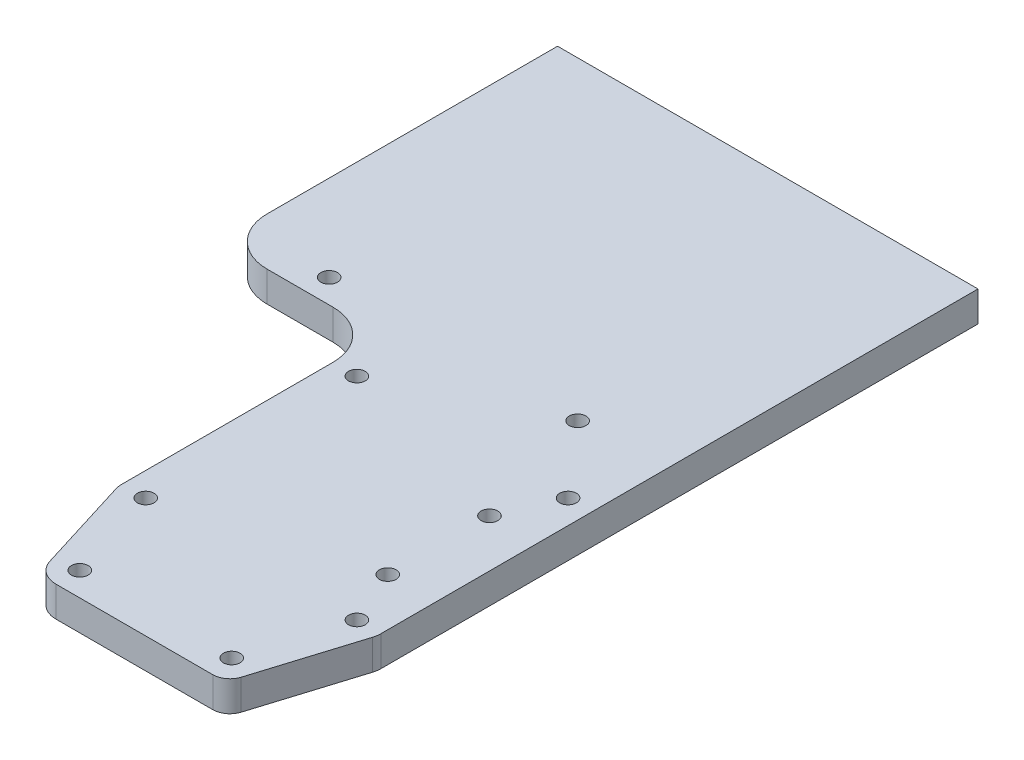
ISO-10303-21;
HEADER;
FILE_DESCRIPTION(('STEP AP214'),'2;1');
FILE_NAME('part.step','',(''),(''),'','','');
FILE_SCHEMA(('AUTOMOTIVE_DESIGN { 1 0 10303 214 1 1 1 1 }'));
ENDSEC;
DATA;
#1=APPLICATION_CONTEXT('core data for automotive mechanical design processes');
#2=APPLICATION_PROTOCOL_DEFINITION('international standard','automotive_design',2000,#1);
#3=PRODUCT_CONTEXT('',#1,'mechanical');
#4=PRODUCT('Part','Part','',(#3));
#5=PRODUCT_RELATED_PRODUCT_CATEGORY('part','',(#4));
#6=PRODUCT_DEFINITION_FORMATION('','',#4);
#7=PRODUCT_DEFINITION_CONTEXT('part definition',#1,'design');
#8=PRODUCT_DEFINITION('design','',#6,#7);
#9=PRODUCT_DEFINITION_SHAPE('','',#8);
#10=(LENGTH_UNIT() NAMED_UNIT(*) SI_UNIT(.MILLI.,.METRE.));
#11=(NAMED_UNIT(*) PLANE_ANGLE_UNIT() SI_UNIT($,.RADIAN.));
#12=(NAMED_UNIT(*) SI_UNIT($,.STERADIAN.) SOLID_ANGLE_UNIT());
#13=UNCERTAINTY_MEASURE_WITH_UNIT(LENGTH_MEASURE(1.E-05),#10,'distance_accuracy_value','');
#14=(GEOMETRIC_REPRESENTATION_CONTEXT(3) GLOBAL_UNCERTAINTY_ASSIGNED_CONTEXT((#13)) GLOBAL_UNIT_ASSIGNED_CONTEXT((#10,
#11,#12)) REPRESENTATION_CONTEXT('',''));
#15=CARTESIAN_POINT('',(0.,0.,0.));
#16=DIRECTION('',(0.,0.,1.));
#17=DIRECTION('',(1.,0.,0.));
#18=AXIS2_PLACEMENT_3D('',#15,#16,#17);
#19=CARTESIAN_POINT('',(0.,0.,-150.));
#20=DIRECTION('',(0.,0.,1.));
#21=DIRECTION('',(1.,0.,0.));
#22=AXIS2_PLACEMENT_3D('',#19,#20,#21);
#23=PLANE('',#22);
#24=DIRECTION('',(1.,0.,0.));
#25=VECTOR('',#24,1.);
#26=CARTESIAN_POINT('',(0.,6.35,-150.));
#27=LINE('',#26,#25);
#28=CARTESIAN_POINT('',(0.,6.35,-150.));
#29=VERTEX_POINT('',#28);
#30=CARTESIAN_POINT('',(88.,6.35,-150.));
#31=VERTEX_POINT('',#30);
#32=EDGE_CURVE('E11',#29,#31,#27,.T.);
#33=ORIENTED_EDGE('',*,*,#32,.T.);
#34=DIRECTION('',(0.,1.,0.));
#35=VECTOR('',#34,1.);
#36=CARTESIAN_POINT('',(88.,6.35,-150.));
#37=LINE('',#36,#35);
#38=CARTESIAN_POINT('',(88.,0.,-150.));
#39=VERTEX_POINT('',#38);
#40=EDGE_CURVE('E57',#39,#31,#37,.T.);
#41=ORIENTED_EDGE('',*,*,#40,.F.);
#42=DIRECTION('',(1.,0.,0.));
#43=VECTOR('',#42,1.);
#44=CARTESIAN_POINT('',(0.,0.,-150.));
#45=LINE('',#44,#43);
#46=CARTESIAN_POINT('',(0.,0.,-150.));
#47=VERTEX_POINT('',#46);
#48=EDGE_CURVE('E304',#47,#39,#45,.T.);
#49=ORIENTED_EDGE('',*,*,#48,.F.);
#50=DIRECTION('',(0.,1.,0.));
#51=VECTOR('',#50,1.);
#52=CARTESIAN_POINT('',(0.,6.35,-150.));
#53=LINE('',#52,#51);
#54=EDGE_CURVE('E44',#47,#29,#53,.T.);
#55=ORIENTED_EDGE('',*,*,#54,.T.);
#56=EDGE_LOOP('',(#33,#41,#49,#55));
#57=FACE_BOUND('',#56,.T.);
#58=ADVANCED_FACE('F37',(#57),#23,.F.);
#59=CARTESIAN_POINT('',(70.,6.35,-84.2));
#60=DIRECTION('',(0.,-1.,0.));
#61=DIRECTION('',(0.,0.,-1.));
#62=AXIS2_PLACEMENT_3D('',#59,#60,#61);
#63=CYLINDRICAL_SURFACE('',#62,1.75);
#64=CARTESIAN_POINT('',(70.,6.35,-84.2));
#65=DIRECTION('',(0.,1.,0.));
#66=DIRECTION('',(0.,0.,1.));
#67=AXIS2_PLACEMENT_3D('',#64,#65,#66);
#68=CIRCLE('',#67,1.75);
#69=CARTESIAN_POINT('',(70.,6.35,-82.45));
#70=VERTEX_POINT('',#69);
#71=EDGE_CURVE('E216',#70,#70,#68,.T.);
#72=ORIENTED_EDGE('',*,*,#71,.T.);
#73=EDGE_LOOP('',(#72));
#74=FACE_BOUND('',#73,.T.);
#75=CARTESIAN_POINT('',(70.,0.,-84.2));
#76=DIRECTION('',(0.,1.,0.));
#77=DIRECTION('',(0.,0.,1.));
#78=AXIS2_PLACEMENT_3D('',#75,#76,#77);
#79=CIRCLE('',#78,1.75);
#80=CARTESIAN_POINT('',(70.,0.,-82.45));
#81=VERTEX_POINT('',#80);
#82=EDGE_CURVE('E162',#81,#81,#79,.T.);
#83=ORIENTED_EDGE('',*,*,#82,.F.);
#84=EDGE_LOOP('',(#83));
#85=FACE_BOUND('',#84,.T.);
#86=ADVANCED_FACE('F365',(#74,#85),#63,.F.);
#87=CARTESIAN_POINT('',(18.,6.35,-84.2));
#88=DIRECTION('',(0.,-1.,0.));
#89=DIRECTION('',(0.,0.,-1.));
#90=AXIS2_PLACEMENT_3D('',#87,#88,#89);
#91=CYLINDRICAL_SURFACE('',#90,1.75);
#92=CARTESIAN_POINT('',(18.,6.35,-84.2));
#93=DIRECTION('',(0.,1.,0.));
#94=DIRECTION('',(0.,0.,1.));
#95=AXIS2_PLACEMENT_3D('',#92,#93,#94);
#96=CIRCLE('',#95,1.75);
#97=CARTESIAN_POINT('',(18.,6.35,-82.45));
#98=VERTEX_POINT('',#97);
#99=EDGE_CURVE('E213',#98,#98,#96,.T.);
#100=ORIENTED_EDGE('',*,*,#99,.T.);
#101=EDGE_LOOP('',(#100));
#102=FACE_BOUND('',#101,.T.);
#103=CARTESIAN_POINT('',(18.,0.,-84.2));
#104=DIRECTION('',(0.,1.,0.));
#105=DIRECTION('',(0.,0.,1.));
#106=AXIS2_PLACEMENT_3D('',#103,#104,#105);
#107=CIRCLE('',#106,1.75);
#108=CARTESIAN_POINT('',(18.,0.,-82.45));
#109=VERTEX_POINT('',#108);
#110=EDGE_CURVE('E165',#109,#109,#107,.T.);
#111=ORIENTED_EDGE('',*,*,#110,.F.);
#112=EDGE_LOOP('',(#111));
#113=FACE_BOUND('',#112,.T.);
#114=ADVANCED_FACE('F369',(#102,#113),#91,.F.);
#115=CARTESIAN_POINT('',(38.8,6.35,-69.2));
#116=DIRECTION('',(0.,-1.,0.));
#117=DIRECTION('',(0.,0.,-1.));
#118=AXIS2_PLACEMENT_3D('',#115,#116,#117);
#119=CYLINDRICAL_SURFACE('',#118,1.75);
#120=CARTESIAN_POINT('',(38.8,6.35,-69.2));
#121=DIRECTION('',(0.,1.,0.));
#122=DIRECTION('',(0.,0.,1.));
#123=AXIS2_PLACEMENT_3D('',#120,#121,#122);
#124=CIRCLE('',#123,1.75);
#125=CARTESIAN_POINT('',(38.8,6.35,-67.45));
#126=VERTEX_POINT('',#125);
#127=EDGE_CURVE('E210',#126,#126,#124,.T.);
#128=ORIENTED_EDGE('',*,*,#127,.T.);
#129=EDGE_LOOP('',(#128));
#130=FACE_BOUND('',#129,.T.);
#131=CARTESIAN_POINT('',(38.8,0.,-69.2));
#132=DIRECTION('',(0.,1.,0.));
#133=DIRECTION('',(0.,0.,1.));
#134=AXIS2_PLACEMENT_3D('',#131,#132,#133);
#135=CIRCLE('',#134,1.75);
#136=CARTESIAN_POINT('',(38.8,0.,-67.45));
#137=VERTEX_POINT('',#136);
#138=EDGE_CURVE('E268',#137,#137,#135,.T.);
#139=ORIENTED_EDGE('',*,*,#138,.F.);
#140=EDGE_LOOP('',(#139));
#141=FACE_BOUND('',#140,.T.);
#142=ADVANCED_FACE('F381',(#130,#141),#119,.F.);
#143=CARTESIAN_POINT('',(83.,6.35,-69.2));
#144=DIRECTION('',(0.,-1.,0.));
#145=DIRECTION('',(0.,0.,-1.));
#146=AXIS2_PLACEMENT_3D('',#143,#144,#145);
#147=CYLINDRICAL_SURFACE('',#146,1.75);
#148=CARTESIAN_POINT('',(83.,6.35,-69.2));
#149=DIRECTION('',(0.,1.,0.));
#150=DIRECTION('',(0.,0.,1.));
#151=AXIS2_PLACEMENT_3D('',#148,#149,#150);
#152=CIRCLE('',#151,1.75);
#153=CARTESIAN_POINT('',(83.,6.35,-67.45));
#154=VERTEX_POINT('',#153);
#155=EDGE_CURVE('E207',#154,#154,#152,.T.);
#156=ORIENTED_EDGE('',*,*,#155,.T.);
#157=EDGE_LOOP('',(#156));
#158=FACE_BOUND('',#157,.T.);
#159=CARTESIAN_POINT('',(83.,0.,-69.2));
#160=DIRECTION('',(0.,1.,0.));
#161=DIRECTION('',(0.,0.,1.));
#162=AXIS2_PLACEMENT_3D('',#159,#160,#161);
#163=CIRCLE('',#162,1.75);
#164=CARTESIAN_POINT('',(83.,0.,-67.45));
#165=VERTEX_POINT('',#164);
#166=EDGE_CURVE('E265',#165,#165,#163,.T.);
#167=ORIENTED_EDGE('',*,*,#166,.F.);
#168=EDGE_LOOP('',(#167));
#169=FACE_BOUND('',#168,.T.);
#170=ADVANCED_FACE('F385',(#158,#169),#147,.F.);
#171=CARTESIAN_POINT('',(83.,6.35,-25.));
#172=DIRECTION('',(0.,-1.,0.));
#173=DIRECTION('',(0.,0.,-1.));
#174=AXIS2_PLACEMENT_3D('',#171,#172,#173);
#175=CYLINDRICAL_SURFACE('',#174,1.74999999999998);
#176=CARTESIAN_POINT('',(83.,6.35,-25.));
#177=DIRECTION('',(0.,1.,0.));
#178=DIRECTION('',(0.,0.,1.));
#179=AXIS2_PLACEMENT_3D('',#176,#177,#178);
#180=CIRCLE('',#179,1.74999999999998);
#181=CARTESIAN_POINT('',(83.,6.35,-23.25));
#182=VERTEX_POINT('',#181);
#183=EDGE_CURVE('E204',#182,#182,#180,.T.);
#184=ORIENTED_EDGE('',*,*,#183,.T.);
#185=EDGE_LOOP('',(#184));
#186=FACE_BOUND('',#185,.T.);
#187=CARTESIAN_POINT('',(83.,0.,-25.));
#188=DIRECTION('',(0.,1.,0.));
#189=DIRECTION('',(0.,0.,1.));
#190=AXIS2_PLACEMENT_3D('',#187,#188,#189);
#191=CIRCLE('',#190,1.74999999999998);
#192=CARTESIAN_POINT('',(83.,0.,-23.25));
#193=VERTEX_POINT('',#192);
#194=EDGE_CURVE('E262',#193,#193,#191,.T.);
#195=ORIENTED_EDGE('',*,*,#194,.F.);
#196=EDGE_LOOP('',(#195));
#197=FACE_BOUND('',#196,.T.);
#198=ADVANCED_FACE('F389',(#186,#197),#175,.F.);
#199=CARTESIAN_POINT('',(38.8,6.35,-25.));
#200=DIRECTION('',(0.,-1.,0.));
#201=DIRECTION('',(0.,0.,-1.));
#202=AXIS2_PLACEMENT_3D('',#199,#200,#201);
#203=CYLINDRICAL_SURFACE('',#202,1.75000000000001);
#204=CARTESIAN_POINT('',(38.8,6.35,-25.));
#205=DIRECTION('',(0.,1.,0.));
#206=DIRECTION('',(0.,0.,1.));
#207=AXIS2_PLACEMENT_3D('',#204,#205,#206);
#208=CIRCLE('',#207,1.75000000000001);
#209=CARTESIAN_POINT('',(38.8,6.35,-23.25));
#210=VERTEX_POINT('',#209);
#211=EDGE_CURVE('E201',#210,#210,#208,.T.);
#212=ORIENTED_EDGE('',*,*,#211,.T.);
#213=EDGE_LOOP('',(#212));
#214=FACE_BOUND('',#213,.T.);
#215=CARTESIAN_POINT('',(38.8,0.,-25.));
#216=DIRECTION('',(0.,1.,0.));
#217=DIRECTION('',(0.,0.,1.));
#218=AXIS2_PLACEMENT_3D('',#215,#216,#217);
#219=CIRCLE('',#218,1.75000000000001);
#220=CARTESIAN_POINT('',(38.8,0.,-23.25));
#221=VERTEX_POINT('',#220);
#222=EDGE_CURVE('E259',#221,#221,#219,.T.);
#223=ORIENTED_EDGE('',*,*,#222,.F.);
#224=EDGE_LOOP('',(#223));
#225=FACE_BOUND('',#224,.T.);
#226=ADVANCED_FACE('F393',(#214,#225),#203,.F.);
#227=CARTESIAN_POINT('',(45.,6.35,-5.));
#228=DIRECTION('',(0.,-1.,0.));
#229=DIRECTION('',(0.,0.,-1.));
#230=AXIS2_PLACEMENT_3D('',#227,#228,#229);
#231=CYLINDRICAL_SURFACE('',#230,1.75);
#232=CARTESIAN_POINT('',(45.,6.35,-5.));
#233=DIRECTION('',(0.,1.,0.));
#234=DIRECTION('',(0.,0.,1.));
#235=AXIS2_PLACEMENT_3D('',#232,#233,#234);
#236=CIRCLE('',#235,1.75);
#237=CARTESIAN_POINT('',(45.,6.35,-3.25));
#238=VERTEX_POINT('',#237);
#239=EDGE_CURVE('E198',#238,#238,#236,.T.);
#240=ORIENTED_EDGE('',*,*,#239,.T.);
#241=EDGE_LOOP('',(#240));
#242=FACE_BOUND('',#241,.T.);
#243=CARTESIAN_POINT('',(45.,0.,-5.));
#244=DIRECTION('',(0.,1.,0.));
#245=DIRECTION('',(0.,0.,1.));
#246=AXIS2_PLACEMENT_3D('',#243,#244,#245);
#247=CIRCLE('',#246,1.75);
#248=CARTESIAN_POINT('',(45.,0.,-3.25));
#249=VERTEX_POINT('',#248);
#250=EDGE_CURVE('E256',#249,#249,#247,.T.);
#251=ORIENTED_EDGE('',*,*,#250,.F.);
#252=EDGE_LOOP('',(#251));
#253=FACE_BOUND('',#252,.T.);
#254=ADVANCED_FACE('F397',(#242,#253),#231,.F.);
#255=CARTESIAN_POINT('',(76.8,6.35,-5.));
#256=DIRECTION('',(0.,-1.,0.));
#257=DIRECTION('',(0.,0.,-1.));
#258=AXIS2_PLACEMENT_3D('',#255,#256,#257);
#259=CYLINDRICAL_SURFACE('',#258,1.75);
#260=CARTESIAN_POINT('',(76.8,6.35,-5.));
#261=DIRECTION('',(0.,1.,0.));
#262=DIRECTION('',(0.,0.,1.));
#263=AXIS2_PLACEMENT_3D('',#260,#261,#262);
#264=CIRCLE('',#263,1.75);
#265=CARTESIAN_POINT('',(76.8,6.35,-3.25));
#266=VERTEX_POINT('',#265);
#267=EDGE_CURVE('E195',#266,#266,#264,.T.);
#268=ORIENTED_EDGE('',*,*,#267,.T.);
#269=EDGE_LOOP('',(#268));
#270=FACE_BOUND('',#269,.T.);
#271=CARTESIAN_POINT('',(76.8,0.,-5.));
#272=DIRECTION('',(0.,1.,0.));
#273=DIRECTION('',(0.,0.,1.));
#274=AXIS2_PLACEMENT_3D('',#271,#272,#273);
#275=CIRCLE('',#274,1.75);
#276=CARTESIAN_POINT('',(76.8,0.,-3.25));
#277=VERTEX_POINT('',#276);
#278=EDGE_CURVE('E253',#277,#277,#275,.T.);
#279=ORIENTED_EDGE('',*,*,#278,.F.);
#280=EDGE_LOOP('',(#279));
#281=FACE_BOUND('',#280,.T.);
#282=ADVANCED_FACE('F401',(#270,#281),#259,.F.);
#283=CARTESIAN_POINT('',(78.,6.35,-57.75));
#284=DIRECTION('',(0.,-1.,0.));
#285=DIRECTION('',(0.,0.,-1.));
#286=AXIS2_PLACEMENT_3D('',#283,#284,#285);
#287=CYLINDRICAL_SURFACE('',#286,1.75);
#288=CARTESIAN_POINT('',(78.,6.35,-57.75));
#289=DIRECTION('',(0.,1.,0.));
#290=DIRECTION('',(0.,0.,1.));
#291=AXIS2_PLACEMENT_3D('',#288,#289,#290);
#292=CIRCLE('',#291,1.75);
#293=CARTESIAN_POINT('',(78.,6.35,-56.));
#294=VERTEX_POINT('',#293);
#295=EDGE_CURVE('E192',#294,#294,#292,.T.);
#296=ORIENTED_EDGE('',*,*,#295,.T.);
#297=EDGE_LOOP('',(#296));
#298=FACE_BOUND('',#297,.T.);
#299=CARTESIAN_POINT('',(78.,0.,-57.75));
#300=DIRECTION('',(0.,1.,0.));
#301=DIRECTION('',(0.,0.,1.));
#302=AXIS2_PLACEMENT_3D('',#299,#300,#301);
#303=CIRCLE('',#302,1.75);
#304=CARTESIAN_POINT('',(78.,0.,-56.));
#305=VERTEX_POINT('',#304);
#306=EDGE_CURVE('E250',#305,#305,#303,.T.);
#307=ORIENTED_EDGE('',*,*,#306,.F.);
#308=EDGE_LOOP('',(#307));
#309=FACE_BOUND('',#308,.T.);
#310=ADVANCED_FACE('F405',(#298,#309),#287,.F.);
#311=CARTESIAN_POINT('',(78.,6.35,-36.45));
#312=DIRECTION('',(0.,-1.,0.));
#313=DIRECTION('',(0.,0.,-1.));
#314=AXIS2_PLACEMENT_3D('',#311,#312,#313);
#315=CYLINDRICAL_SURFACE('',#314,1.75);
#316=CARTESIAN_POINT('',(78.,6.35,-36.45));
#317=DIRECTION('',(0.,1.,0.));
#318=DIRECTION('',(0.,0.,1.));
#319=AXIS2_PLACEMENT_3D('',#316,#317,#318);
#320=CIRCLE('',#319,1.75);
#321=CARTESIAN_POINT('',(78.,6.35,-34.7));
#322=VERTEX_POINT('',#321);
#323=EDGE_CURVE('E189',#322,#322,#320,.T.);
#324=ORIENTED_EDGE('',*,*,#323,.T.);
#325=EDGE_LOOP('',(#324));
#326=FACE_BOUND('',#325,.T.);
#327=CARTESIAN_POINT('',(78.,0.,-36.45));
#328=DIRECTION('',(0.,1.,0.));
#329=DIRECTION('',(0.,0.,1.));
#330=AXIS2_PLACEMENT_3D('',#327,#328,#329);
#331=CIRCLE('',#330,1.75);
#332=CARTESIAN_POINT('',(78.,0.,-34.7));
#333=VERTEX_POINT('',#332);
#334=EDGE_CURVE('E247',#333,#333,#331,.T.);
#335=ORIENTED_EDGE('',*,*,#334,.F.);
#336=EDGE_LOOP('',(#335));
#337=FACE_BOUND('',#336,.T.);
#338=ADVANCED_FACE('F408',(#326,#337),#315,.F.);
#339=CARTESIAN_POINT('',(10.,6.35,-89.2));
#340=DIRECTION('',(0.,-1.,0.));
#341=DIRECTION('',(0.,0.,-1.));
#342=AXIS2_PLACEMENT_3D('',#339,#340,#341);
#343=CYLINDRICAL_SURFACE('',#342,10.);
#344=CARTESIAN_POINT('',(10.,6.35,-89.2));
#345=DIRECTION('',(0.,1.,0.));
#346=DIRECTION('',(0.,0.,1.));
#347=AXIS2_PLACEMENT_3D('',#344,#345,#346);
#348=CIRCLE('',#347,10.);
#349=CARTESIAN_POINT('',(0.,6.35,-89.2));
#350=VERTEX_POINT('',#349);
#351=CARTESIAN_POINT('',(10.,6.35,-79.2));
#352=VERTEX_POINT('',#351);
#353=EDGE_CURVE('E298',#350,#352,#348,.T.);
#354=ORIENTED_EDGE('',*,*,#353,.F.);
#355=DIRECTION('',(0.,-1.,0.));
#356=VECTOR('',#355,1.);
#357=CARTESIAN_POINT('',(0.,6.35,-89.2));
#358=LINE('',#357,#356);
#359=CARTESIAN_POINT('',(0.,0.,-89.2));
#360=VERTEX_POINT('',#359);
#361=EDGE_CURVE('E296',#360,#350,#358,.F.);
#362=ORIENTED_EDGE('',*,*,#361,.F.);
#363=CARTESIAN_POINT('',(10.,0.,-89.2));
#364=DIRECTION('',(0.,1.,0.));
#365=DIRECTION('',(0.,0.,1.));
#366=AXIS2_PLACEMENT_3D('',#363,#364,#365);
#367=CIRCLE('',#366,10.);
#368=CARTESIAN_POINT('',(10.,0.,-79.2));
#369=VERTEX_POINT('',#368);
#370=EDGE_CURVE('E294',#369,#360,#367,.F.);
#371=ORIENTED_EDGE('',*,*,#370,.F.);
#372=DIRECTION('',(0.,-1.,0.));
#373=VECTOR('',#372,1.);
#374=CARTESIAN_POINT('',(10.,6.35,-79.2));
#375=LINE('',#374,#373);
#376=EDGE_CURVE('E289',#352,#369,#375,.T.);
#377=ORIENTED_EDGE('',*,*,#376,.F.);
#378=EDGE_LOOP('',(#354,#362,#371,#377));
#379=FACE_BOUND('',#378,.T.);
#380=ADVANCED_FACE('F340',(#379),#343,.T.);
#381=CARTESIAN_POINT('',(0.,6.35,-79.2));
#382=DIRECTION('',(0.,0.,1.));
#383=DIRECTION('',(1.,0.,0.));
#384=AXIS2_PLACEMENT_3D('',#381,#382,#383);
#385=PLANE('',#384);
#386=DIRECTION('',(-1.,0.,0.));
#387=VECTOR('',#386,1.);
#388=CARTESIAN_POINT('',(0.,0.,-79.2));
#389=LINE('',#388,#387);
#390=CARTESIAN_POINT('',(23.8,0.,-79.2));
#391=VERTEX_POINT('',#390);
#392=EDGE_CURVE('E241',#391,#369,#389,.T.);
#393=ORIENTED_EDGE('',*,*,#392,.F.);
#394=DIRECTION('',(0.,-1.,0.));
#395=VECTOR('',#394,1.);
#396=CARTESIAN_POINT('',(23.8,6.35,-79.2));
#397=LINE('',#396,#395);
#398=CARTESIAN_POINT('',(23.8,6.35,-79.2));
#399=VERTEX_POINT('',#398);
#400=EDGE_CURVE('E292',#391,#399,#397,.F.);
#401=ORIENTED_EDGE('',*,*,#400,.T.);
#402=DIRECTION('',(-1.,0.,0.));
#403=VECTOR('',#402,1.);
#404=CARTESIAN_POINT('',(0.,6.35,-79.2));
#405=LINE('',#404,#403);
#406=EDGE_CURVE('E185',#399,#352,#405,.T.);
#407=ORIENTED_EDGE('',*,*,#406,.T.);
#408=ORIENTED_EDGE('',*,*,#376,.T.);
#409=EDGE_LOOP('',(#393,#401,#407,#408));
#410=FACE_BOUND('',#409,.T.);
#411=ADVANCED_FACE('F346',(#410),#385,.T.);
#412=CARTESIAN_POINT('',(23.8,6.35,-69.2));
#413=DIRECTION('',(0.,1.,0.));
#414=DIRECTION('',(0.,0.,1.));
#415=AXIS2_PLACEMENT_3D('',#412,#413,#414);
#416=CYLINDRICAL_SURFACE('',#415,10.);
#417=CARTESIAN_POINT('',(23.8,6.35,-69.2));
#418=DIRECTION('',(0.,1.,0.));
#419=DIRECTION('',(0.,0.,1.));
#420=AXIS2_PLACEMENT_3D('',#417,#418,#419);
#421=CIRCLE('',#420,10.);
#422=CARTESIAN_POINT('',(33.8,6.35,-69.2));
#423=VERTEX_POINT('',#422);
#424=EDGE_CURVE('E302',#399,#423,#421,.F.);
#425=ORIENTED_EDGE('',*,*,#424,.F.);
#426=ORIENTED_EDGE('',*,*,#400,.F.);
#427=CARTESIAN_POINT('',(23.8,0.,-69.2));
#428=DIRECTION('',(0.,1.,0.));
#429=DIRECTION('',(0.,0.,1.));
#430=AXIS2_PLACEMENT_3D('',#427,#428,#429);
#431=CIRCLE('',#430,10.);
#432=CARTESIAN_POINT('',(33.8,0.,-69.2));
#433=VERTEX_POINT('',#432);
#434=EDGE_CURVE('E300',#433,#391,#431,.T.);
#435=ORIENTED_EDGE('',*,*,#434,.F.);
#436=DIRECTION('',(0.,-1.,0.));
#437=VECTOR('',#436,1.);
#438=CARTESIAN_POINT('',(33.8,0.,-69.2));
#439=LINE('',#438,#437);
#440=EDGE_CURVE('E147',#423,#433,#439,.T.);
#441=ORIENTED_EDGE('',*,*,#440,.F.);
#442=EDGE_LOOP('',(#425,#426,#435,#441));
#443=FACE_BOUND('',#442,.T.);
#444=ADVANCED_FACE('F349',(#443),#416,.F.);
#445=CARTESIAN_POINT('',(33.8,6.35,0.));
#446=DIRECTION('',(-1.,0.,0.));
#447=DIRECTION('',(0.,0.,1.));
#448=AXIS2_PLACEMENT_3D('',#445,#446,#447);
#449=PLANE('',#448);
#450=DIRECTION('',(0.,0.,-1.));
#451=VECTOR('',#450,1.);
#452=CARTESIAN_POINT('',(33.8,6.35,0.));
#453=LINE('',#452,#451);
#454=CARTESIAN_POINT('',(33.8,6.35,-25.));
#455=VERTEX_POINT('',#454);
#456=EDGE_CURVE('E161',#455,#423,#453,.T.);
#457=ORIENTED_EDGE('',*,*,#456,.T.);
#458=ORIENTED_EDGE('',*,*,#440,.T.);
#459=DIRECTION('',(0.,0.,-1.));
#460=VECTOR('',#459,1.);
#461=CARTESIAN_POINT('',(33.8,0.,0.));
#462=LINE('',#461,#460);
#463=CARTESIAN_POINT('',(33.8,0.,-25.));
#464=VERTEX_POINT('',#463);
#465=EDGE_CURVE('E244',#464,#433,#462,.T.);
#466=ORIENTED_EDGE('',*,*,#465,.F.);
#467=DIRECTION('',(0.,-1.,0.));
#468=VECTOR('',#467,1.);
#469=CARTESIAN_POINT('',(33.8,6.35,-25.));
#470=LINE('',#469,#468);
#471=EDGE_CURVE('E219',#455,#464,#470,.T.);
#472=ORIENTED_EDGE('',*,*,#471,.F.);
#473=EDGE_LOOP('',(#457,#458,#466,#472));
#474=FACE_BOUND('',#473,.T.);
#475=ADVANCED_FACE('F352',(#474),#449,.T.);
#476=CARTESIAN_POINT('',(38.8,6.35,-25.));
#477=DIRECTION('',(0.,-1.,0.));
#478=DIRECTION('',(0.,0.,-1.));
#479=AXIS2_PLACEMENT_3D('',#476,#477,#478);
#480=CYLINDRICAL_SURFACE('',#479,4.99999999999999);
#481=CARTESIAN_POINT('',(38.8,0.,-25.));
#482=DIRECTION('',(0.,1.,0.));
#483=DIRECTION('',(0.,0.,1.));
#484=AXIS2_PLACEMENT_3D('',#481,#482,#483);
#485=CIRCLE('',#484,4.99999999999999);
#486=CARTESIAN_POINT('',(34.0242133691277,0.,-23.5195061444296));
#487=VERTEX_POINT('',#486);
#488=EDGE_CURVE('E144',#487,#464,#485,.F.);
#489=ORIENTED_EDGE('',*,*,#488,.F.);
#490=DIRECTION('',(0.,-1.,0.));
#491=VECTOR('',#490,1.);
#492=CARTESIAN_POINT('',(34.0242133691277,6.35,-23.5195061444296));
#493=LINE('',#492,#491);
#494=CARTESIAN_POINT('',(34.0242133691277,6.35,-23.5195061444296));
#495=VERTEX_POINT('',#494);
#496=EDGE_CURVE('E137',#495,#487,#493,.T.);
#497=ORIENTED_EDGE('',*,*,#496,.F.);
#498=CARTESIAN_POINT('',(38.8,6.35,-25.));
#499=DIRECTION('',(0.,1.,0.));
#500=DIRECTION('',(0.,0.,1.));
#501=AXIS2_PLACEMENT_3D('',#498,#499,#500);
#502=CIRCLE('',#501,4.99999999999999);
#503=EDGE_CURVE('E141',#495,#455,#502,.F.);
#504=ORIENTED_EDGE('',*,*,#503,.T.);
#505=ORIENTED_EDGE('',*,*,#471,.T.);
#506=EDGE_LOOP('',(#489,#497,#504,#505));
#507=FACE_BOUND('',#506,.T.);
#508=ADVANCED_FACE('F139',(#507),#480,.T.);
#509=CARTESIAN_POINT('',(37.692966220145,6.35,-11.684819528245));
#510=DIRECTION('',(0.955157326174453,0.,-0.296098771114082));
#511=DIRECTION('',(-0.296098771114082,0.,-0.955157326174453));
#512=AXIS2_PLACEMENT_3D('',#509,#510,#511);
#513=PLANE('',#512);
#514=DIRECTION('',(0.296098771114082,0.,0.955157326174453));
#515=VECTOR('',#514,1.);
#516=CARTESIAN_POINT('',(37.692966220145,0.,-11.684819528245));
#517=LINE('',#516,#515);
#518=CARTESIAN_POINT('',(40.2242133691278,0.,-3.51950614442959));
#519=VERTEX_POINT('',#518);
#520=EDGE_CURVE('E221',#487,#519,#517,.T.);
#521=ORIENTED_EDGE('',*,*,#520,.T.);
#522=DIRECTION('',(0.,-1.,0.));
#523=VECTOR('',#522,1.);
#524=CARTESIAN_POINT('',(40.2242133691278,6.35,-3.51950614442959));
#525=LINE('',#524,#523);
#526=CARTESIAN_POINT('',(40.2242133691278,6.35,-3.51950614442959));
#527=VERTEX_POINT('',#526);
#528=EDGE_CURVE('E148',#527,#519,#525,.T.);
#529=ORIENTED_EDGE('',*,*,#528,.F.);
#530=DIRECTION('',(0.296098771114082,0.,0.955157326174453));
#531=VECTOR('',#530,1.);
#532=CARTESIAN_POINT('',(37.692966220145,6.35,-11.684819528245));
#533=LINE('',#532,#531);
#534=EDGE_CURVE('E151',#495,#527,#533,.T.);
#535=ORIENTED_EDGE('',*,*,#534,.F.);
#536=ORIENTED_EDGE('',*,*,#496,.T.);
#537=EDGE_LOOP('',(#521,#529,#535,#536));
#538=FACE_BOUND('',#537,.T.);
#539=ADVANCED_FACE('F152',(#538),#513,.F.);
#540=CARTESIAN_POINT('',(45.,6.35,-5.));
#541=DIRECTION('',(0.,-1.,0.));
#542=DIRECTION('',(0.,0.,-1.));
#543=AXIS2_PLACEMENT_3D('',#540,#541,#542);
#544=CYLINDRICAL_SURFACE('',#543,5.);
#545=CARTESIAN_POINT('',(45.,0.,-5.));
#546=DIRECTION('',(0.,1.,0.));
#547=DIRECTION('',(0.,0.,1.));
#548=AXIS2_PLACEMENT_3D('',#545,#546,#547);
#549=CIRCLE('',#548,5.);
#550=CARTESIAN_POINT('',(45.,0.,0.));
#551=VERTEX_POINT('',#550);
#552=EDGE_CURVE('E223',#519,#551,#549,.T.);
#553=ORIENTED_EDGE('',*,*,#552,.T.);
#554=DIRECTION('',(0.,-1.,0.));
#555=VECTOR('',#554,1.);
#556=CARTESIAN_POINT('',(45.,6.35,0.));
#557=LINE('',#556,#555);
#558=CARTESIAN_POINT('',(45.,6.35,0.));
#559=VERTEX_POINT('',#558);
#560=EDGE_CURVE('E283',#559,#551,#557,.T.);
#561=ORIENTED_EDGE('',*,*,#560,.F.);
#562=CARTESIAN_POINT('',(45.,6.35,-5.));
#563=DIRECTION('',(0.,1.,0.));
#564=DIRECTION('',(0.,0.,1.));
#565=AXIS2_PLACEMENT_3D('',#562,#563,#564);
#566=CIRCLE('',#565,5.);
#567=EDGE_CURVE('E156',#527,#559,#566,.T.);
#568=ORIENTED_EDGE('',*,*,#567,.F.);
#569=ORIENTED_EDGE('',*,*,#528,.T.);
#570=EDGE_LOOP('',(#553,#561,#568,#569));
#571=FACE_BOUND('',#570,.T.);
#572=ADVANCED_FACE('F333',(#571),#544,.T.);
#573=CARTESIAN_POINT('',(0.,6.35,0.));
#574=DIRECTION('',(0.,0.,-1.));
#575=DIRECTION('',(-1.,0.,0.));
#576=AXIS2_PLACEMENT_3D('',#573,#574,#575);
#577=PLANE('',#576);
#578=DIRECTION('',(1.,0.,0.));
#579=VECTOR('',#578,1.);
#580=CARTESIAN_POINT('',(0.,0.,0.));
#581=LINE('',#580,#579);
#582=CARTESIAN_POINT('',(77.8381949512166,0.,0.));
#583=VERTEX_POINT('',#582);
#584=EDGE_CURVE('E225',#551,#583,#581,.T.);
#585=ORIENTED_EDGE('',*,*,#584,.T.);
#586=DIRECTION('',(0.,-1.,0.));
#587=VECTOR('',#586,1.);
#588=CARTESIAN_POINT('',(77.8381949512166,6.35,0.));
#589=LINE('',#588,#587);
#590=CARTESIAN_POINT('',(77.8381949512166,6.35,0.));
#591=VERTEX_POINT('',#590);
#592=EDGE_CURVE('E280',#591,#583,#589,.T.);
#593=ORIENTED_EDGE('',*,*,#592,.F.);
#594=DIRECTION('',(1.,0.,0.));
#595=VECTOR('',#594,1.);
#596=CARTESIAN_POINT('',(0.,6.35,0.));
#597=LINE('',#596,#595);
#598=EDGE_CURVE('E169',#559,#591,#597,.T.);
#599=ORIENTED_EDGE('',*,*,#598,.F.);
#600=ORIENTED_EDGE('',*,*,#560,.T.);
#601=EDGE_LOOP('',(#585,#593,#599,#600));
#602=FACE_BOUND('',#601,.T.);
#603=ADVANCED_FACE('F329',(#602),#577,.F.);
#604=CARTESIAN_POINT('',(77.8381949512166,6.35,-3.5912234942091));
#605=DIRECTION('',(0.,-1.,0.));
#606=DIRECTION('',(0.,0.,-1.));
#607=AXIS2_PLACEMENT_3D('',#604,#605,#606);
#608=CYLINDRICAL_SURFACE('',#607,3.5912234942091);
#609=CARTESIAN_POINT('',(77.8381949512166,0.,-3.5912234942091));
#610=DIRECTION('',(0.,1.,0.));
#611=DIRECTION('',(0.,0.,1.));
#612=AXIS2_PLACEMENT_3D('',#609,#610,#611);
#613=CIRCLE('',#612,3.5912234942091);
#614=CARTESIAN_POINT('',(81.2683783816402,0.,-2.52786663077777));
#615=VERTEX_POINT('',#614);
#616=EDGE_CURVE('E227',#583,#615,#613,.T.);
#617=ORIENTED_EDGE('',*,*,#616,.T.);
#618=DIRECTION('',(0.,-1.,0.));
#619=VECTOR('',#618,1.);
#620=CARTESIAN_POINT('',(81.2683783816402,6.35,-2.52786663077777));
#621=LINE('',#620,#619);
#622=CARTESIAN_POINT('',(81.2683783816402,6.35,-2.52786663077777));
#623=VERTEX_POINT('',#622);
#624=EDGE_CURVE('E278',#623,#615,#621,.T.);
#625=ORIENTED_EDGE('',*,*,#624,.F.);
#626=CARTESIAN_POINT('',(77.8381949512166,6.35,-3.5912234942091));
#627=DIRECTION('',(0.,1.,0.));
#628=DIRECTION('',(0.,0.,1.));
#629=AXIS2_PLACEMENT_3D('',#626,#627,#628);
#630=CIRCLE('',#629,3.5912234942091);
#631=EDGE_CURVE('E171',#591,#623,#630,.T.);
#632=ORIENTED_EDGE('',*,*,#631,.F.);
#633=ORIENTED_EDGE('',*,*,#592,.T.);
#634=EDGE_LOOP('',(#617,#625,#632,#633));
#635=FACE_BOUND('',#634,.T.);
#636=ADVANCED_FACE('F325',(#635),#608,.T.);
#637=CARTESIAN_POINT('',(73.4282818411634,6.35,22.7627673707606));
#638=DIRECTION('',(0.955157326174454,0.,0.29609877111408));
#639=DIRECTION('',(0.29609877111408,0.,-0.955157326174454));
#640=AXIS2_PLACEMENT_3D('',#637,#638,#639);
#641=PLANE('',#640);
#642=DIRECTION('',(-0.29609877111408,0.,0.955157326174454));
#643=VECTOR('',#642,1.);
#644=CARTESIAN_POINT('',(73.4282818411634,0.,22.7627673707606));
#645=LINE('',#644,#643);
#646=CARTESIAN_POINT('',(87.7757866308723,0.,-23.5195061444296));
#647=VERTEX_POINT('',#646);
#648=EDGE_CURVE('E230',#647,#615,#645,.T.);
#649=ORIENTED_EDGE('',*,*,#648,.F.);
#650=DIRECTION('',(0.,-1.,0.));
#651=VECTOR('',#650,1.);
#652=CARTESIAN_POINT('',(87.7757866308723,6.35,-23.5195061444296));
#653=LINE('',#652,#651);
#654=CARTESIAN_POINT('',(87.7757866308723,6.35,-23.5195061444296));
#655=VERTEX_POINT('',#654);
#656=EDGE_CURVE('E276',#655,#647,#653,.T.);
#657=ORIENTED_EDGE('',*,*,#656,.F.);
#658=DIRECTION('',(-0.29609877111408,0.,0.955157326174454));
#659=VECTOR('',#658,1.);
#660=CARTESIAN_POINT('',(73.4282818411634,6.35,22.7627673707606));
#661=LINE('',#660,#659);
#662=EDGE_CURVE('E173',#655,#623,#661,.T.);
#663=ORIENTED_EDGE('',*,*,#662,.T.);
#664=ORIENTED_EDGE('',*,*,#624,.T.);
#665=EDGE_LOOP('',(#649,#657,#663,#664));
#666=FACE_BOUND('',#665,.T.);
#667=ADVANCED_FACE('F320',(#666),#641,.T.);
#668=CARTESIAN_POINT('',(83.,6.35,-25.));
#669=DIRECTION('',(0.,-1.,0.));
#670=DIRECTION('',(0.,0.,-1.));
#671=AXIS2_PLACEMENT_3D('',#668,#669,#670);
#672=CYLINDRICAL_SURFACE('',#671,5.00000000000001);
#673=CARTESIAN_POINT('',(83.,0.,-25.));
#674=DIRECTION('',(0.,1.,0.));
#675=DIRECTION('',(0.,0.,1.));
#676=AXIS2_PLACEMENT_3D('',#673,#674,#675);
#677=CIRCLE('',#676,5.00000000000001);
#678=CARTESIAN_POINT('',(88.,0.,-25.));
#679=VERTEX_POINT('',#678);
#680=EDGE_CURVE('E233',#679,#647,#677,.F.);
#681=ORIENTED_EDGE('',*,*,#680,.F.);
#682=DIRECTION('',(0.,-1.,0.));
#683=VECTOR('',#682,1.);
#684=CARTESIAN_POINT('',(88.,6.35,-25.));
#685=LINE('',#684,#683);
#686=CARTESIAN_POINT('',(88.,6.35,-25.));
#687=VERTEX_POINT('',#686);
#688=EDGE_CURVE('E274',#687,#679,#685,.T.);
#689=ORIENTED_EDGE('',*,*,#688,.F.);
#690=CARTESIAN_POINT('',(83.,6.35,-25.));
#691=DIRECTION('',(0.,1.,0.));
#692=DIRECTION('',(0.,0.,1.));
#693=AXIS2_PLACEMENT_3D('',#690,#691,#692);
#694=CIRCLE('',#693,5.00000000000001);
#695=EDGE_CURVE('E176',#687,#655,#694,.F.);
#696=ORIENTED_EDGE('',*,*,#695,.T.);
#697=ORIENTED_EDGE('',*,*,#656,.T.);
#698=EDGE_LOOP('',(#681,#689,#696,#697));
#699=FACE_BOUND('',#698,.T.);
#700=ADVANCED_FACE('F315',(#699),#672,.T.);
#701=CARTESIAN_POINT('',(88.,6.35,0.));
#702=DIRECTION('',(-1.,0.,0.));
#703=DIRECTION('',(0.,0.,1.));
#704=AXIS2_PLACEMENT_3D('',#701,#702,#703);
#705=PLANE('',#704);
#706=DIRECTION('',(0.,0.,-1.));
#707=VECTOR('',#706,1.);
#708=CARTESIAN_POINT('',(88.,0.,0.));
#709=LINE('',#708,#707);
#710=EDGE_CURVE('E236',#679,#39,#709,.T.);
#711=ORIENTED_EDGE('',*,*,#710,.T.);
#712=ORIENTED_EDGE('',*,*,#40,.T.);
#713=DIRECTION('',(0.,0.,-1.));
#714=VECTOR('',#713,1.);
#715=CARTESIAN_POINT('',(88.,6.35,0.));
#716=LINE('',#715,#714);
#717=EDGE_CURVE('E179',#687,#31,#716,.T.);
#718=ORIENTED_EDGE('',*,*,#717,.F.);
#719=ORIENTED_EDGE('',*,*,#688,.T.);
#720=EDGE_LOOP('',(#711,#712,#718,#719));
#721=FACE_BOUND('',#720,.T.);
#722=ADVANCED_FACE('F312',(#721),#705,.F.);
#723=CARTESIAN_POINT('',(0.,6.35,0.));
#724=DIRECTION('',(-1.,0.,0.));
#725=DIRECTION('',(0.,0.,1.));
#726=AXIS2_PLACEMENT_3D('',#723,#724,#725);
#727=PLANE('',#726);
#728=ORIENTED_EDGE('',*,*,#54,.F.);
#729=DIRECTION('',(0.,0.,-1.));
#730=VECTOR('',#729,1.);
#731=CARTESIAN_POINT('',(0.,0.,0.));
#732=LINE('',#731,#730);
#733=EDGE_CURVE('E238',#360,#47,#732,.T.);
#734=ORIENTED_EDGE('',*,*,#733,.F.);
#735=ORIENTED_EDGE('',*,*,#361,.T.);
#736=DIRECTION('',(0.,0.,-1.));
#737=VECTOR('',#736,1.);
#738=CARTESIAN_POINT('',(0.,6.35,0.));
#739=LINE('',#738,#737);
#740=EDGE_CURVE('E182',#350,#29,#739,.T.);
#741=ORIENTED_EDGE('',*,*,#740,.T.);
#742=EDGE_LOOP('',(#728,#734,#735,#741));
#743=FACE_BOUND('',#742,.T.);
#744=ADVANCED_FACE('F337',(#743),#727,.T.);
#745=CARTESIAN_POINT('',(0.,0.,0.));
#746=DIRECTION('',(0.,1.,0.));
#747=DIRECTION('',(0.,0.,1.));
#748=AXIS2_PLACEMENT_3D('',#745,#746,#747);
#749=PLANE('',#748);
#750=ORIENTED_EDGE('',*,*,#733,.T.);
#751=ORIENTED_EDGE('',*,*,#48,.T.);
#752=ORIENTED_EDGE('',*,*,#710,.F.);
#753=ORIENTED_EDGE('',*,*,#680,.T.);
#754=ORIENTED_EDGE('',*,*,#648,.T.);
#755=ORIENTED_EDGE('',*,*,#616,.F.);
#756=ORIENTED_EDGE('',*,*,#584,.F.);
#757=ORIENTED_EDGE('',*,*,#552,.F.);
#758=ORIENTED_EDGE('',*,*,#520,.F.);
#759=ORIENTED_EDGE('',*,*,#488,.T.);
#760=ORIENTED_EDGE('',*,*,#465,.T.);
#761=ORIENTED_EDGE('',*,*,#434,.T.);
#762=ORIENTED_EDGE('',*,*,#392,.T.);
#763=ORIENTED_EDGE('',*,*,#370,.T.);
#764=EDGE_LOOP('',(#750,#751,#752,#753,#754,#755,#756,#757,#758,#759,#760,#761,#762,#763));
#765=FACE_BOUND('',#764,.T.);
#766=ORIENTED_EDGE('',*,*,#334,.T.);
#767=EDGE_LOOP('',(#766));
#768=FACE_BOUND('',#767,.T.);
#769=ORIENTED_EDGE('',*,*,#306,.T.);
#770=EDGE_LOOP('',(#769));
#771=FACE_BOUND('',#770,.T.);
#772=ORIENTED_EDGE('',*,*,#278,.T.);
#773=EDGE_LOOP('',(#772));
#774=FACE_BOUND('',#773,.T.);
#775=ORIENTED_EDGE('',*,*,#250,.T.);
#776=EDGE_LOOP('',(#775));
#777=FACE_BOUND('',#776,.T.);
#778=ORIENTED_EDGE('',*,*,#222,.T.);
#779=EDGE_LOOP('',(#778));
#780=FACE_BOUND('',#779,.T.);
#781=ORIENTED_EDGE('',*,*,#194,.T.);
#782=EDGE_LOOP('',(#781));
#783=FACE_BOUND('',#782,.T.);
#784=ORIENTED_EDGE('',*,*,#166,.T.);
#785=EDGE_LOOP('',(#784));
#786=FACE_BOUND('',#785,.T.);
#787=ORIENTED_EDGE('',*,*,#138,.T.);
#788=EDGE_LOOP('',(#787));
#789=FACE_BOUND('',#788,.T.);
#790=ORIENTED_EDGE('',*,*,#110,.T.);
#791=EDGE_LOOP('',(#790));
#792=FACE_BOUND('',#791,.T.);
#793=ORIENTED_EDGE('',*,*,#82,.T.);
#794=EDGE_LOOP('',(#793));
#795=FACE_BOUND('',#794,.T.);
#796=ADVANCED_FACE('F308',(#765,#768,#771,#774,#777,#780,#783,#786,#789,#792,#795),#749,.F.);
#797=CARTESIAN_POINT('',(0.,6.35,0.));
#798=DIRECTION('',(0.,1.,0.));
#799=DIRECTION('',(0.,0.,1.));
#800=AXIS2_PLACEMENT_3D('',#797,#798,#799);
#801=PLANE('',#800);
#802=ORIENTED_EDGE('',*,*,#32,.F.);
#803=ORIENTED_EDGE('',*,*,#740,.F.);
#804=ORIENTED_EDGE('',*,*,#353,.T.);
#805=ORIENTED_EDGE('',*,*,#406,.F.);
#806=ORIENTED_EDGE('',*,*,#424,.T.);
#807=ORIENTED_EDGE('',*,*,#456,.F.);
#808=ORIENTED_EDGE('',*,*,#503,.F.);
#809=ORIENTED_EDGE('',*,*,#534,.T.);
#810=ORIENTED_EDGE('',*,*,#567,.T.);
#811=ORIENTED_EDGE('',*,*,#598,.T.);
#812=ORIENTED_EDGE('',*,*,#631,.T.);
#813=ORIENTED_EDGE('',*,*,#662,.F.);
#814=ORIENTED_EDGE('',*,*,#695,.F.);
#815=ORIENTED_EDGE('',*,*,#717,.T.);
#816=EDGE_LOOP('',(#802,#803,#804,#805,#806,#807,#808,#809,#810,#811,#812,#813,#814,#815));
#817=FACE_BOUND('',#816,.T.);
#818=ORIENTED_EDGE('',*,*,#323,.F.);
#819=EDGE_LOOP('',(#818));
#820=FACE_BOUND('',#819,.T.);
#821=ORIENTED_EDGE('',*,*,#295,.F.);
#822=EDGE_LOOP('',(#821));
#823=FACE_BOUND('',#822,.T.);
#824=ORIENTED_EDGE('',*,*,#267,.F.);
#825=EDGE_LOOP('',(#824));
#826=FACE_BOUND('',#825,.T.);
#827=ORIENTED_EDGE('',*,*,#239,.F.);
#828=EDGE_LOOP('',(#827));
#829=FACE_BOUND('',#828,.T.);
#830=ORIENTED_EDGE('',*,*,#211,.F.);
#831=EDGE_LOOP('',(#830));
#832=FACE_BOUND('',#831,.T.);
#833=ORIENTED_EDGE('',*,*,#183,.F.);
#834=EDGE_LOOP('',(#833));
#835=FACE_BOUND('',#834,.T.);
#836=ORIENTED_EDGE('',*,*,#155,.F.);
#837=EDGE_LOOP('',(#836));
#838=FACE_BOUND('',#837,.T.);
#839=ORIENTED_EDGE('',*,*,#127,.F.);
#840=EDGE_LOOP('',(#839));
#841=FACE_BOUND('',#840,.T.);
#842=ORIENTED_EDGE('',*,*,#99,.F.);
#843=EDGE_LOOP('',(#842));
#844=FACE_BOUND('',#843,.T.);
#845=ORIENTED_EDGE('',*,*,#71,.F.);
#846=EDGE_LOOP('',(#845));
#847=FACE_BOUND('',#846,.T.);
#848=ADVANCED_FACE('F158',(#817,#820,#823,#826,#829,#832,#835,#838,#841,#844,#847),#801,.T.);
#849=CLOSED_SHELL('',(#58,#86,#114,#142,#170,#198,#226,#254,#282,#310,#338,#380,#411,#444,#475,
#508,#539,#572,#603,#636,#667,#700,#722,#744,#796,#848));
#850=MANIFOLD_SOLID_BREP('B2',#849);
#851=ADVANCED_BREP_SHAPE_REPRESENTATION('',(#18,#850),#14);
#852=SHAPE_DEFINITION_REPRESENTATION(#9,#851);
ENDSEC;
END-ISO-10303-21;
